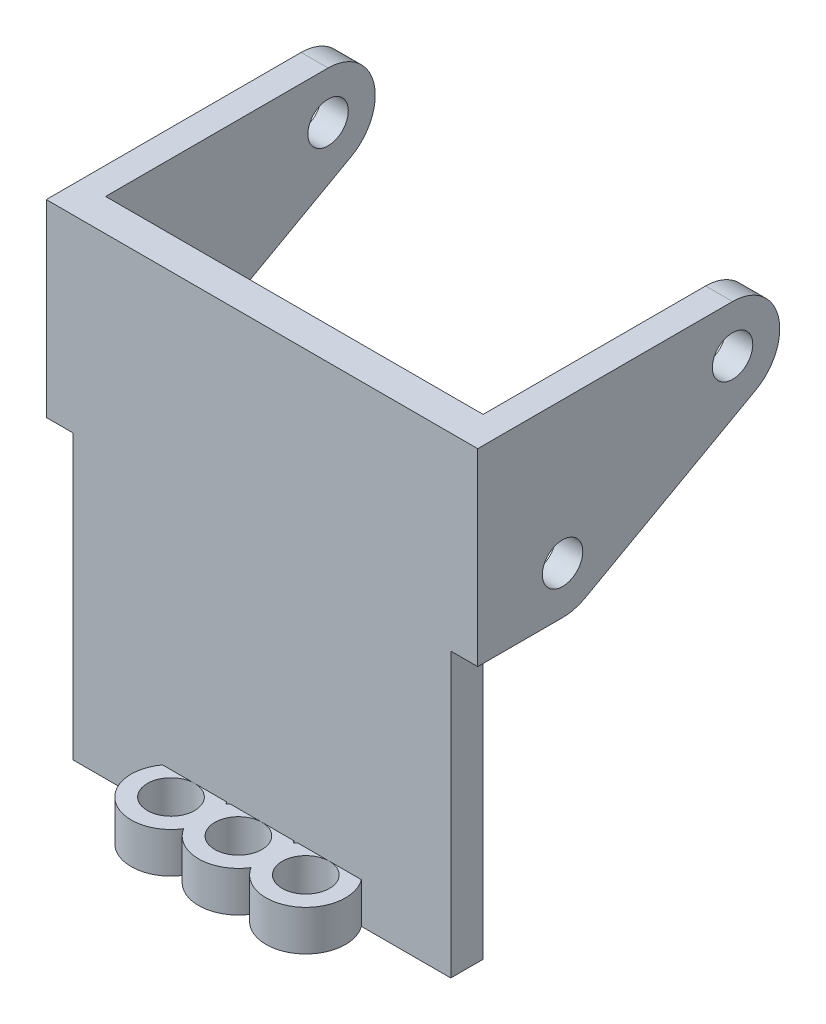
ISO-10303-21;
HEADER;
FILE_DESCRIPTION(('STEP AP214'),'2;1');
FILE_NAME('part.step','',(''),(''),'','','');
FILE_SCHEMA(('AUTOMOTIVE_DESIGN { 1 0 10303 214 1 1 1 1 }'));
ENDSEC;
DATA;
#1=APPLICATION_CONTEXT('core data for automotive mechanical design processes');
#2=APPLICATION_PROTOCOL_DEFINITION('international standard','automotive_design',2000,#1);
#3=PRODUCT_CONTEXT('',#1,'mechanical');
#4=PRODUCT('Part','Part','',(#3));
#5=PRODUCT_RELATED_PRODUCT_CATEGORY('part','',(#4));
#6=PRODUCT_DEFINITION_FORMATION('','',#4);
#7=PRODUCT_DEFINITION_CONTEXT('part definition',#1,'design');
#8=PRODUCT_DEFINITION('design','',#6,#7);
#9=PRODUCT_DEFINITION_SHAPE('','',#8);
#10=(LENGTH_UNIT() NAMED_UNIT(*) SI_UNIT(.MILLI.,.METRE.));
#11=(NAMED_UNIT(*) PLANE_ANGLE_UNIT() SI_UNIT($,.RADIAN.));
#12=(NAMED_UNIT(*) SI_UNIT($,.STERADIAN.) SOLID_ANGLE_UNIT());
#13=UNCERTAINTY_MEASURE_WITH_UNIT(LENGTH_MEASURE(1.E-05),#10,'distance_accuracy_value','');
#14=(GEOMETRIC_REPRESENTATION_CONTEXT(3) GLOBAL_UNCERTAINTY_ASSIGNED_CONTEXT((#13)) GLOBAL_UNIT_ASSIGNED_CONTEXT((#10,
#11,#12)) REPRESENTATION_CONTEXT('',''));
#15=CARTESIAN_POINT('',(0.,0.,0.));
#16=DIRECTION('',(0.,0.,1.));
#17=DIRECTION('',(1.,0.,0.));
#18=AXIS2_PLACEMENT_3D('',#15,#16,#17);
#19=CARTESIAN_POINT('',(-5.,3.,0.));
#20=DIRECTION('',(0.,-1.,0.));
#21=DIRECTION('',(0.,0.,-1.));
#22=AXIS2_PLACEMENT_3D('',#19,#20,#21);
#23=CYLINDRICAL_SURFACE('',#22,2.95);
#24=CARTESIAN_POINT('',(-5.,3.,0.));
#25=DIRECTION('',(0.,1.,0.));
#26=DIRECTION('',(1.,0.,0.));
#27=AXIS2_PLACEMENT_3D('',#24,#25,#26);
#28=CIRCLE('',#27,2.95);
#29=CARTESIAN_POINT('',(-7.37486841740758,3.,-1.75));
#30=VERTEX_POINT('',#29);
#31=CARTESIAN_POINT('',(-2.5,3.,1.56604597633658));
#32=VERTEX_POINT('',#31);
#33=EDGE_CURVE('E390',#30,#32,#28,.T.);
#34=ORIENTED_EDGE('',*,*,#33,.F.);
#35=DIRECTION('',(0.,-1.,0.));
#36=VECTOR('',#35,1.);
#37=CARTESIAN_POINT('',(-7.37486841740758,3.,-1.75));
#38=LINE('',#37,#36);
#39=CARTESIAN_POINT('',(-7.37486841740758,0.,-1.75));
#40=VERTEX_POINT('',#39);
#41=EDGE_CURVE('E374',#30,#40,#38,.T.);
#42=ORIENTED_EDGE('',*,*,#41,.T.);
#43=CARTESIAN_POINT('',(-5.,0.,0.));
#44=DIRECTION('',(0.,1.,0.));
#45=DIRECTION('',(1.,0.,0.));
#46=AXIS2_PLACEMENT_3D('',#43,#44,#45);
#47=CIRCLE('',#46,2.95);
#48=CARTESIAN_POINT('',(-2.5,0.,1.56604597633658));
#49=VERTEX_POINT('',#48);
#50=EDGE_CURVE('E381',#40,#49,#47,.T.);
#51=ORIENTED_EDGE('',*,*,#50,.T.);
#52=DIRECTION('',(0.,-1.,0.));
#53=VECTOR('',#52,1.);
#54=CARTESIAN_POINT('',(-2.5,1.5,1.56604597633658));
#55=LINE('',#54,#53);
#56=EDGE_CURVE('E396',#32,#49,#55,.T.);
#57=ORIENTED_EDGE('',*,*,#56,.F.);
#58=EDGE_LOOP('',(#34,#42,#51,#57));
#59=FACE_BOUND('',#58,.T.);
#60=ADVANCED_FACE('F69',(#59),#23,.T.);
#61=CARTESIAN_POINT('',(5.,3.,0.));
#62=DIRECTION('',(0.,-1.,0.));
#63=DIRECTION('',(0.,0.,-1.));
#64=AXIS2_PLACEMENT_3D('',#61,#62,#63);
#65=CYLINDRICAL_SURFACE('',#64,2.95);
#66=CARTESIAN_POINT('',(5.,3.,0.));
#67=DIRECTION('',(0.,1.,0.));
#68=DIRECTION('',(1.,0.,0.));
#69=AXIS2_PLACEMENT_3D('',#66,#67,#68);
#70=CIRCLE('',#69,2.95);
#71=CARTESIAN_POINT('',(2.62513158259242,3.,-1.75));
#72=VERTEX_POINT('',#71);
#73=CARTESIAN_POINT('',(2.5,3.,-1.56604597633658));
#74=VERTEX_POINT('',#73);
#75=EDGE_CURVE('E430',#72,#74,#70,.T.);
#76=ORIENTED_EDGE('',*,*,#75,.F.);
#77=DIRECTION('',(0.,-1.,0.));
#78=VECTOR('',#77,1.);
#79=CARTESIAN_POINT('',(2.62513158259242,3.,-1.75));
#80=LINE('',#79,#78);
#81=CARTESIAN_POINT('',(2.62513158259241,0.,-1.75));
#82=VERTEX_POINT('',#81);
#83=EDGE_CURVE('E366',#72,#82,#80,.T.);
#84=ORIENTED_EDGE('',*,*,#83,.T.);
#85=CARTESIAN_POINT('',(5.,0.,0.));
#86=DIRECTION('',(0.,1.,0.));
#87=DIRECTION('',(1.,0.,0.));
#88=AXIS2_PLACEMENT_3D('',#85,#86,#87);
#89=CIRCLE('',#88,2.95);
#90=CARTESIAN_POINT('',(2.5,0.,-1.56604597633658));
#91=VERTEX_POINT('',#90);
#92=EDGE_CURVE('E425',#82,#91,#89,.T.);
#93=ORIENTED_EDGE('',*,*,#92,.T.);
#94=DIRECTION('',(0.,-1.,0.));
#95=VECTOR('',#94,1.);
#96=CARTESIAN_POINT('',(2.5,1.5,-1.56604597633658));
#97=LINE('',#96,#95);
#98=EDGE_CURVE('E411',#91,#74,#97,.F.);
#99=ORIENTED_EDGE('',*,*,#98,.T.);
#100=EDGE_LOOP('',(#76,#84,#93,#99));
#101=FACE_BOUND('',#100,.T.);
#102=ADVANCED_FACE('F488',(#101),#65,.T.);
#103=CARTESIAN_POINT('',(0.,3.,0.));
#104=DIRECTION('',(0.,-1.,0.));
#105=DIRECTION('',(0.,0.,-1.));
#106=AXIS2_PLACEMENT_3D('',#103,#104,#105);
#107=CYLINDRICAL_SURFACE('',#106,2.95);
#108=CARTESIAN_POINT('',(0.,3.,0.));
#109=DIRECTION('',(0.,1.,0.));
#110=DIRECTION('',(1.,0.,0.));
#111=AXIS2_PLACEMENT_3D('',#108,#109,#110);
#112=CIRCLE('',#111,2.95);
#113=CARTESIAN_POINT('',(-2.37486841740758,3.,-1.75));
#114=VERTEX_POINT('',#113);
#115=CARTESIAN_POINT('',(-2.5,3.,-1.56604597633658));
#116=VERTEX_POINT('',#115);
#117=EDGE_CURVE('E412',#114,#116,#112,.T.);
#118=ORIENTED_EDGE('',*,*,#117,.F.);
#119=DIRECTION('',(0.,-1.,0.));
#120=VECTOR('',#119,1.);
#121=CARTESIAN_POINT('',(-2.37486841740758,3.,-1.75));
#122=LINE('',#121,#120);
#123=CARTESIAN_POINT('',(-2.37486841740758,0.,-1.75));
#124=VERTEX_POINT('',#123);
#125=EDGE_CURVE('E73',#114,#124,#122,.T.);
#126=ORIENTED_EDGE('',*,*,#125,.T.);
#127=CARTESIAN_POINT('',(0.,0.,0.));
#128=DIRECTION('',(0.,1.,0.));
#129=DIRECTION('',(1.,0.,0.));
#130=AXIS2_PLACEMENT_3D('',#127,#128,#129);
#131=CIRCLE('',#130,2.95);
#132=CARTESIAN_POINT('',(-2.5,0.,-1.56604597633658));
#133=VERTEX_POINT('',#132);
#134=EDGE_CURVE('E417',#124,#133,#131,.T.);
#135=ORIENTED_EDGE('',*,*,#134,.T.);
#136=DIRECTION('',(0.,-1.,0.));
#137=VECTOR('',#136,1.);
#138=CARTESIAN_POINT('',(-2.5,1.5,-1.56604597633658));
#139=LINE('',#138,#137);
#140=EDGE_CURVE('E389',#133,#116,#139,.F.);
#141=ORIENTED_EDGE('',*,*,#140,.T.);
#142=EDGE_LOOP('',(#118,#126,#135,#141));
#143=FACE_BOUND('',#142,.T.);
#144=ADVANCED_FACE('F440',(#143),#107,.T.);
#145=CARTESIAN_POINT('',(-5.,3.,0.));
#146=DIRECTION('',(0.,-1.,0.));
#147=DIRECTION('',(0.,0.,-1.));
#148=AXIS2_PLACEMENT_3D('',#145,#146,#147);
#149=CYLINDRICAL_SURFACE('',#148,1.75);
#150=CARTESIAN_POINT('',(-5.,0.,0.));
#151=DIRECTION('',(0.,1.,0.));
#152=DIRECTION('',(0.,0.,1.));
#153=AXIS2_PLACEMENT_3D('',#150,#151,#152);
#154=CIRCLE('',#153,1.75);
#155=CARTESIAN_POINT('',(-5.,0.,1.75));
#156=VERTEX_POINT('',#155);
#157=EDGE_CURVE('E382',#156,#156,#154,.T.);
#158=ORIENTED_EDGE('',*,*,#157,.F.);
#159=EDGE_LOOP('',(#158));
#160=FACE_BOUND('',#159,.T.);
#161=CARTESIAN_POINT('',(-5.,3.,0.));
#162=DIRECTION('',(0.,1.,0.));
#163=DIRECTION('',(0.,0.,1.));
#164=AXIS2_PLACEMENT_3D('',#161,#162,#163);
#165=CIRCLE('',#164,1.75);
#166=CARTESIAN_POINT('',(-5.,3.,-1.75));
#167=VERTEX_POINT('',#166);
#168=EDGE_CURVE('E378',#167,#167,#165,.T.);
#169=ORIENTED_EDGE('',*,*,#168,.T.);
#170=EDGE_LOOP('',(#169));
#171=FACE_BOUND('',#170,.T.);
#172=ADVANCED_FACE('F516',(#160,#171),#149,.F.);
#173=CARTESIAN_POINT('',(-5.,0.,0.));
#174=DIRECTION('',(0.,1.,0.));
#175=DIRECTION('',(0.,0.,1.));
#176=AXIS2_PLACEMENT_3D('',#173,#174,#175);
#177=PLANE('',#176);
#178=ORIENTED_EDGE('',*,*,#157,.T.);
#179=EDGE_LOOP('',(#178));
#180=FACE_BOUND('',#179,.T.);
#181=DIRECTION('',(-1.,0.,0.));
#182=VECTOR('',#181,1.);
#183=CARTESIAN_POINT('',(49.0821892133316,0.,-1.75));
#184=LINE('',#183,#182);
#185=CARTESIAN_POINT('',(-2.62513158259242,0.,-1.75));
#186=VERTEX_POINT('',#185);
#187=EDGE_CURVE('E448',#124,#186,#184,.T.);
#188=ORIENTED_EDGE('',*,*,#187,.T.);
#189=EDGE_CURVE('E391',#133,#186,#47,.T.);
#190=ORIENTED_EDGE('',*,*,#189,.F.);
#191=ORIENTED_EDGE('',*,*,#134,.F.);
#192=EDGE_LOOP('',(#188,#190,#191));
#193=FACE_BOUND('',#192,.T.);
#194=CARTESIAN_POINT('',(0.,0.,0.));
#195=DIRECTION('',(0.,1.,0.));
#196=DIRECTION('',(0.,0.,1.));
#197=AXIS2_PLACEMENT_3D('',#194,#195,#196);
#198=CIRCLE('',#197,1.75);
#199=CARTESIAN_POINT('',(0.,0.,1.75));
#200=VERTEX_POINT('',#199);
#201=EDGE_CURVE('E404',#200,#200,#198,.T.);
#202=ORIENTED_EDGE('',*,*,#201,.T.);
#203=EDGE_LOOP('',(#202));
#204=FACE_BOUND('',#203,.T.);
#205=CARTESIAN_POINT('',(2.37486841740758,0.,-1.75));
#206=VERTEX_POINT('',#205);
#207=EDGE_CURVE('E356',#82,#206,#184,.T.);
#208=ORIENTED_EDGE('',*,*,#207,.T.);
#209=EDGE_CURVE('E414',#91,#206,#131,.T.);
#210=ORIENTED_EDGE('',*,*,#209,.F.);
#211=ORIENTED_EDGE('',*,*,#92,.F.);
#212=EDGE_LOOP('',(#208,#210,#211));
#213=FACE_BOUND('',#212,.T.);
#214=CARTESIAN_POINT('',(5.,0.,0.));
#215=DIRECTION('',(0.,1.,0.));
#216=DIRECTION('',(0.,0.,1.));
#217=AXIS2_PLACEMENT_3D('',#214,#215,#216);
#218=CIRCLE('',#217,1.75);
#219=CARTESIAN_POINT('',(5.,0.,1.75));
#220=VERTEX_POINT('',#219);
#221=EDGE_CURVE('E377',#220,#220,#218,.T.);
#222=ORIENTED_EDGE('',*,*,#221,.T.);
#223=EDGE_LOOP('',(#222));
#224=FACE_BOUND('',#223,.T.);
#225=ORIENTED_EDGE('',*,*,#50,.F.);
#226=CARTESIAN_POINT('',(-14.,0.,-1.75));
#227=VERTEX_POINT('',#226);
#228=EDGE_CURVE('E343',#40,#227,#184,.T.);
#229=ORIENTED_EDGE('',*,*,#228,.T.);
#230=DIRECTION('',(0.,0.,1.));
#231=VECTOR('',#230,1.);
#232=CARTESIAN_POINT('',(-14.,0.,-4.14999999999999));
#233=LINE('',#232,#231);
#234=CARTESIAN_POINT('',(-14.,0.,-4.15));
#235=VERTEX_POINT('',#234);
#236=EDGE_CURVE('E335',#235,#227,#233,.T.);
#237=ORIENTED_EDGE('',*,*,#236,.F.);
#238=DIRECTION('',(-1.,0.,0.));
#239=VECTOR('',#238,1.);
#240=CARTESIAN_POINT('',(49.0821892133316,0.,-4.15));
#241=LINE('',#240,#239);
#242=CARTESIAN_POINT('',(14.,0.,-4.15));
#243=VERTEX_POINT('',#242);
#244=EDGE_CURVE('E352',#243,#235,#241,.T.);
#245=ORIENTED_EDGE('',*,*,#244,.F.);
#246=DIRECTION('',(0.,0.,1.));
#247=VECTOR('',#246,1.);
#248=CARTESIAN_POINT('',(14.,0.,-4.15000000000001));
#249=LINE('',#248,#247);
#250=CARTESIAN_POINT('',(14.,0.,-1.75));
#251=VERTEX_POINT('',#250);
#252=EDGE_CURVE('E340',#243,#251,#249,.T.);
#253=ORIENTED_EDGE('',*,*,#252,.T.);
#254=CARTESIAN_POINT('',(7.37486841740759,0.,-1.75));
#255=VERTEX_POINT('',#254);
#256=EDGE_CURVE('E348',#251,#255,#184,.T.);
#257=ORIENTED_EDGE('',*,*,#256,.T.);
#258=CARTESIAN_POINT('',(2.5,0.,1.56604597633658));
#259=VERTEX_POINT('',#258);
#260=EDGE_CURVE('E431',#259,#255,#89,.T.);
#261=ORIENTED_EDGE('',*,*,#260,.F.);
#262=EDGE_CURVE('E403',#49,#259,#131,.T.);
#263=ORIENTED_EDGE('',*,*,#262,.F.);
#264=EDGE_LOOP('',(#225,#229,#237,#245,#253,#257,#261,#263));
#265=FACE_BOUND('',#264,.T.);
#266=ADVANCED_FACE('F446',(#180,#193,#204,#213,#224,#265),#177,.F.);
#267=CARTESIAN_POINT('',(-5.,3.,0.));
#268=DIRECTION('',(0.,1.,0.));
#269=DIRECTION('',(0.,0.,1.));
#270=AXIS2_PLACEMENT_3D('',#267,#268,#269);
#271=PLANE('',#270);
#272=DIRECTION('',(1.,0.,0.));
#273=VECTOR('',#272,1.);
#274=CARTESIAN_POINT('',(-5.,3.,-1.75));
#275=LINE('',#274,#273);
#276=EDGE_CURVE('E361',#30,#167,#275,.T.);
#277=ORIENTED_EDGE('',*,*,#276,.F.);
#278=ORIENTED_EDGE('',*,*,#33,.T.);
#279=CARTESIAN_POINT('',(2.5,3.,1.56604597633658));
#280=VERTEX_POINT('',#279);
#281=EDGE_CURVE('E413',#32,#280,#112,.T.);
#282=ORIENTED_EDGE('',*,*,#281,.T.);
#283=CARTESIAN_POINT('',(7.37486841740758,3.,-1.75));
#284=VERTEX_POINT('',#283);
#285=EDGE_CURVE('E407',#280,#284,#70,.T.);
#286=ORIENTED_EDGE('',*,*,#285,.T.);
#287=CARTESIAN_POINT('',(5.,3.,-1.75));
#288=VERTEX_POINT('',#287);
#289=EDGE_CURVE('E365',#288,#284,#275,.T.);
#290=ORIENTED_EDGE('',*,*,#289,.F.);
#291=CARTESIAN_POINT('',(5.,3.,0.));
#292=DIRECTION('',(0.,1.,0.));
#293=DIRECTION('',(0.,0.,1.));
#294=AXIS2_PLACEMENT_3D('',#291,#292,#293);
#295=CIRCLE('',#294,1.75);
#296=EDGE_CURVE('E422',#288,#288,#295,.T.);
#297=ORIENTED_EDGE('',*,*,#296,.F.);
#298=EDGE_CURVE('E370',#72,#288,#275,.T.);
#299=ORIENTED_EDGE('',*,*,#298,.F.);
#300=ORIENTED_EDGE('',*,*,#75,.T.);
#301=CARTESIAN_POINT('',(2.37486841740758,3.,-1.75));
#302=VERTEX_POINT('',#301);
#303=EDGE_CURVE('E408',#74,#302,#112,.T.);
#304=ORIENTED_EDGE('',*,*,#303,.T.);
#305=CARTESIAN_POINT('',(0.,3.,-1.75));
#306=VERTEX_POINT('',#305);
#307=EDGE_CURVE('E358',#306,#302,#275,.T.);
#308=ORIENTED_EDGE('',*,*,#307,.F.);
#309=CARTESIAN_POINT('',(0.,3.,0.));
#310=DIRECTION('',(0.,1.,0.));
#311=DIRECTION('',(0.,0.,1.));
#312=AXIS2_PLACEMENT_3D('',#309,#310,#311);
#313=CIRCLE('',#312,1.75);
#314=EDGE_CURVE('E400',#306,#306,#313,.T.);
#315=ORIENTED_EDGE('',*,*,#314,.F.);
#316=EDGE_CURVE('E360',#114,#306,#275,.T.);
#317=ORIENTED_EDGE('',*,*,#316,.F.);
#318=ORIENTED_EDGE('',*,*,#117,.T.);
#319=CARTESIAN_POINT('',(-2.62513158259242,3.,-1.75));
#320=VERTEX_POINT('',#319);
#321=EDGE_CURVE('E386',#116,#320,#28,.T.);
#322=ORIENTED_EDGE('',*,*,#321,.T.);
#323=EDGE_CURVE('E373',#167,#320,#275,.T.);
#324=ORIENTED_EDGE('',*,*,#323,.F.);
#325=ORIENTED_EDGE('',*,*,#168,.F.);
#326=EDGE_LOOP('',(#277,#278,#282,#286,#290,#297,#299,#300,#304,#308,#315,#317,#318,#322,#324,#325));
#327=FACE_BOUND('',#326,.T.);
#328=ADVANCED_FACE('F466',(#327),#271,.T.);
#329=ORIENTED_EDGE('',*,*,#189,.T.);
#330=DIRECTION('',(0.,-1.,0.));
#331=VECTOR('',#330,1.);
#332=CARTESIAN_POINT('',(-2.62513158259242,3.,-1.75));
#333=LINE('',#332,#331);
#334=EDGE_CURVE('E369',#186,#320,#333,.F.);
#335=ORIENTED_EDGE('',*,*,#334,.T.);
#336=ORIENTED_EDGE('',*,*,#321,.F.);
#337=ORIENTED_EDGE('',*,*,#140,.F.);
#338=EDGE_LOOP('',(#329,#335,#336,#337));
#339=FACE_BOUND('',#338,.T.);
#340=ADVANCED_FACE('F473',(#339),#23,.T.);
#341=CARTESIAN_POINT('',(5.,3.,0.));
#342=DIRECTION('',(0.,-1.,0.));
#343=DIRECTION('',(0.,0.,-1.));
#344=AXIS2_PLACEMENT_3D('',#341,#342,#343);
#345=CYLINDRICAL_SURFACE('',#344,1.75);
#346=ORIENTED_EDGE('',*,*,#221,.F.);
#347=EDGE_LOOP('',(#346));
#348=FACE_BOUND('',#347,.T.);
#349=ORIENTED_EDGE('',*,*,#296,.T.);
#350=EDGE_LOOP('',(#349));
#351=FACE_BOUND('',#350,.T.);
#352=ADVANCED_FACE('F480',(#348,#351),#345,.F.);
#353=CARTESIAN_POINT('',(0.,3.,0.));
#354=DIRECTION('',(0.,-1.,0.));
#355=DIRECTION('',(0.,0.,-1.));
#356=AXIS2_PLACEMENT_3D('',#353,#354,#355);
#357=CYLINDRICAL_SURFACE('',#356,1.75);
#358=ORIENTED_EDGE('',*,*,#201,.F.);
#359=EDGE_LOOP('',(#358));
#360=FACE_BOUND('',#359,.T.);
#361=ORIENTED_EDGE('',*,*,#314,.T.);
#362=EDGE_LOOP('',(#361));
#363=FACE_BOUND('',#362,.T.);
#364=ADVANCED_FACE('F478',(#360,#363),#357,.F.);
#365=ORIENTED_EDGE('',*,*,#260,.T.);
#366=DIRECTION('',(0.,-1.,0.));
#367=VECTOR('',#366,1.);
#368=CARTESIAN_POINT('',(7.37486841740758,3.,-1.75));
#369=LINE('',#368,#367);
#370=EDGE_CURVE('E362',#255,#284,#369,.F.);
#371=ORIENTED_EDGE('',*,*,#370,.T.);
#372=ORIENTED_EDGE('',*,*,#285,.F.);
#373=DIRECTION('',(0.,-1.,0.));
#374=VECTOR('',#373,1.);
#375=CARTESIAN_POINT('',(2.5,1.5,1.56604597633658));
#376=LINE('',#375,#374);
#377=EDGE_CURVE('E385',#280,#259,#376,.T.);
#378=ORIENTED_EDGE('',*,*,#377,.T.);
#379=EDGE_LOOP('',(#365,#371,#372,#378));
#380=FACE_BOUND('',#379,.T.);
#381=ADVANCED_FACE('F71',(#380),#65,.T.);
#382=ORIENTED_EDGE('',*,*,#209,.T.);
#383=DIRECTION('',(0.,-1.,0.));
#384=VECTOR('',#383,1.);
#385=CARTESIAN_POINT('',(2.37486841740758,3.,-1.75));
#386=LINE('',#385,#384);
#387=EDGE_CURVE('E399',#206,#302,#386,.F.);
#388=ORIENTED_EDGE('',*,*,#387,.T.);
#389=ORIENTED_EDGE('',*,*,#303,.F.);
#390=ORIENTED_EDGE('',*,*,#98,.F.);
#391=EDGE_LOOP('',(#382,#388,#389,#390));
#392=FACE_BOUND('',#391,.T.);
#393=ADVANCED_FACE('F487',(#392),#107,.T.);
#394=ORIENTED_EDGE('',*,*,#281,.F.);
#395=ORIENTED_EDGE('',*,*,#56,.T.);
#396=ORIENTED_EDGE('',*,*,#262,.T.);
#397=ORIENTED_EDGE('',*,*,#377,.F.);
#398=EDGE_LOOP('',(#394,#395,#396,#397));
#399=FACE_BOUND('',#398,.T.);
#400=ADVANCED_FACE('F453',(#399),#107,.T.);
#401=CARTESIAN_POINT('',(49.0821892133316,0.,-1.75));
#402=DIRECTION('',(0.,0.,1.));
#403=DIRECTION('',(1.,0.,0.));
#404=AXIS2_PLACEMENT_3D('',#401,#402,#403);
#405=PLANE('',#404);
#406=ORIENTED_EDGE('',*,*,#41,.F.);
#407=ORIENTED_EDGE('',*,*,#276,.T.);
#408=ORIENTED_EDGE('',*,*,#323,.T.);
#409=ORIENTED_EDGE('',*,*,#334,.F.);
#410=ORIENTED_EDGE('',*,*,#187,.F.);
#411=ORIENTED_EDGE('',*,*,#125,.F.);
#412=ORIENTED_EDGE('',*,*,#316,.T.);
#413=ORIENTED_EDGE('',*,*,#307,.T.);
#414=ORIENTED_EDGE('',*,*,#387,.F.);
#415=ORIENTED_EDGE('',*,*,#207,.F.);
#416=ORIENTED_EDGE('',*,*,#83,.F.);
#417=ORIENTED_EDGE('',*,*,#298,.T.);
#418=ORIENTED_EDGE('',*,*,#289,.T.);
#419=ORIENTED_EDGE('',*,*,#370,.F.);
#420=ORIENTED_EDGE('',*,*,#256,.F.);
#421=DIRECTION('',(0.,1.,0.));
#422=VECTOR('',#421,1.);
#423=CARTESIAN_POINT('',(14.,0.,-1.75));
#424=LINE('',#423,#422);
#425=CARTESIAN_POINT('',(14.,21.,-1.75));
#426=VERTEX_POINT('',#425);
#427=EDGE_CURVE('E346',#251,#426,#424,.T.);
#428=ORIENTED_EDGE('',*,*,#427,.T.);
#429=DIRECTION('',(-1.,0.,0.));
#430=VECTOR('',#429,1.);
#431=CARTESIAN_POINT('',(16.,21.,-1.75));
#432=LINE('',#431,#430);
#433=CARTESIAN_POINT('',(16.,21.,-1.75));
#434=VERTEX_POINT('',#433);
#435=EDGE_CURVE('E325',#434,#426,#432,.T.);
#436=ORIENTED_EDGE('',*,*,#435,.F.);
#437=DIRECTION('',(0.,-1.,0.));
#438=VECTOR('',#437,1.);
#439=CARTESIAN_POINT('',(16.,35.,-1.75));
#440=LINE('',#439,#438);
#441=CARTESIAN_POINT('',(16.,35.,-1.75));
#442=VERTEX_POINT('',#441);
#443=EDGE_CURVE('E298',#442,#434,#440,.T.);
#444=ORIENTED_EDGE('',*,*,#443,.F.);
#445=DIRECTION('',(-1.,0.,0.));
#446=VECTOR('',#445,1.);
#447=CARTESIAN_POINT('',(49.0821892133316,35.,-1.75));
#448=LINE('',#447,#446);
#449=CARTESIAN_POINT('',(-16.,35.,-1.75000000000001));
#450=VERTEX_POINT('',#449);
#451=EDGE_CURVE('E253',#442,#450,#448,.T.);
#452=ORIENTED_EDGE('',*,*,#451,.T.);
#453=DIRECTION('',(0.,1.,0.));
#454=VECTOR('',#453,1.);
#455=CARTESIAN_POINT('',(-16.,35.,-1.75000000000001));
#456=LINE('',#455,#454);
#457=CARTESIAN_POINT('',(-16.,21.,-1.75000000000001));
#458=VERTEX_POINT('',#457);
#459=EDGE_CURVE('E246',#458,#450,#456,.T.);
#460=ORIENTED_EDGE('',*,*,#459,.F.);
#461=DIRECTION('',(1.,0.,0.));
#462=VECTOR('',#461,1.);
#463=CARTESIAN_POINT('',(-16.,21.,-1.75000000000001));
#464=LINE('',#463,#462);
#465=CARTESIAN_POINT('',(-14.,21.,-1.75000000000001));
#466=VERTEX_POINT('',#465);
#467=EDGE_CURVE('E251',#458,#466,#464,.T.);
#468=ORIENTED_EDGE('',*,*,#467,.T.);
#469=DIRECTION('',(0.,1.,0.));
#470=VECTOR('',#469,1.);
#471=CARTESIAN_POINT('',(-14.,0.,-1.75));
#472=LINE('',#471,#470);
#473=EDGE_CURVE('E332',#227,#466,#472,.T.);
#474=ORIENTED_EDGE('',*,*,#473,.F.);
#475=ORIENTED_EDGE('',*,*,#228,.F.);
#476=EDGE_LOOP('',(#406,#407,#408,#409,#410,#411,#412,#413,#414,#415,#416,#417,#418,#419,#420,
#428,#436,#444,#452,#460,#468,#474,#475));
#477=FACE_BOUND('',#476,.T.);
#478=ADVANCED_FACE('F248',(#477),#405,.T.);
#479=CARTESIAN_POINT('',(14.,35.,-24.15));
#480=DIRECTION('',(1.,0.,0.));
#481=DIRECTION('',(0.,0.,-1.));
#482=AXIS2_PLACEMENT_3D('',#479,#480,#481);
#483=PLANE('',#482);
#484=DIRECTION('',(0.,0.,-1.));
#485=VECTOR('',#484,1.);
#486=CARTESIAN_POINT('',(14.,21.,-1.75));
#487=LINE('',#486,#485);
#488=CARTESIAN_POINT('',(14.,21.,-4.15));
#489=VERTEX_POINT('',#488);
#490=EDGE_CURVE('E92',#426,#489,#487,.T.);
#491=ORIENTED_EDGE('',*,*,#490,.F.);
#492=ORIENTED_EDGE('',*,*,#427,.F.);
#493=ORIENTED_EDGE('',*,*,#252,.F.);
#494=DIRECTION('',(0.,1.,0.));
#495=VECTOR('',#494,1.);
#496=CARTESIAN_POINT('',(14.,0.,-4.15));
#497=LINE('',#496,#495);
#498=EDGE_CURVE('E344',#243,#489,#497,.T.);
#499=ORIENTED_EDGE('',*,*,#498,.T.);
#500=EDGE_LOOP('',(#491,#492,#493,#499));
#501=FACE_BOUND('',#500,.T.);
#502=ADVANCED_FACE('F507',(#501),#483,.T.);
#503=CARTESIAN_POINT('',(49.0821892133316,35.,-1.75));
#504=DIRECTION('',(0.,1.,0.));
#505=DIRECTION('',(0.,0.,1.));
#506=AXIS2_PLACEMENT_3D('',#503,#504,#505);
#507=PLANE('',#506);
#508=ORIENTED_EDGE('',*,*,#451,.F.);
#509=DIRECTION('',(0.,0.,1.));
#510=VECTOR('',#509,1.);
#511=CARTESIAN_POINT('',(16.,35.,-20.65));
#512=LINE('',#511,#510);
#513=CARTESIAN_POINT('',(16.,35.,-20.65));
#514=VERTEX_POINT('',#513);
#515=EDGE_CURVE('E294',#514,#442,#512,.T.);
#516=ORIENTED_EDGE('',*,*,#515,.F.);
#517=DIRECTION('',(-1.,0.,0.));
#518=VECTOR('',#517,1.);
#519=CARTESIAN_POINT('',(16.,35.,-20.65));
#520=LINE('',#519,#518);
#521=CARTESIAN_POINT('',(14.,35.,-20.65));
#522=VERTEX_POINT('',#521);
#523=EDGE_CURVE('E328',#514,#522,#520,.T.);
#524=ORIENTED_EDGE('',*,*,#523,.T.);
#525=DIRECTION('',(0.,0.,1.));
#526=VECTOR('',#525,1.);
#527=CARTESIAN_POINT('',(14.,35.,-20.65));
#528=LINE('',#527,#526);
#529=CARTESIAN_POINT('',(14.,35.,-4.15));
#530=VERTEX_POINT('',#529);
#531=EDGE_CURVE('E309',#522,#530,#528,.T.);
#532=ORIENTED_EDGE('',*,*,#531,.T.);
#533=DIRECTION('',(-1.,0.,0.));
#534=VECTOR('',#533,1.);
#535=CARTESIAN_POINT('',(49.0821892133316,35.,-4.15));
#536=LINE('',#535,#534);
#537=CARTESIAN_POINT('',(-14.,35.,-4.15));
#538=VERTEX_POINT('',#537);
#539=EDGE_CURVE('E349',#530,#538,#536,.T.);
#540=ORIENTED_EDGE('',*,*,#539,.T.);
#541=DIRECTION('',(0.,0.,-1.));
#542=VECTOR('',#541,1.);
#543=CARTESIAN_POINT('',(-14.,35.,-24.15));
#544=LINE('',#543,#542);
#545=CARTESIAN_POINT('',(-14.,35.,-20.65));
#546=VERTEX_POINT('',#545);
#547=EDGE_CURVE('E541',#538,#546,#544,.T.);
#548=ORIENTED_EDGE('',*,*,#547,.T.);
#549=DIRECTION('',(1.,0.,0.));
#550=VECTOR('',#549,1.);
#551=CARTESIAN_POINT('',(-16.,35.,-20.65));
#552=LINE('',#551,#550);
#553=CARTESIAN_POINT('',(-16.,35.,-20.65));
#554=VERTEX_POINT('',#553);
#555=EDGE_CURVE('E272',#554,#546,#552,.T.);
#556=ORIENTED_EDGE('',*,*,#555,.F.);
#557=DIRECTION('',(0.,0.,-1.));
#558=VECTOR('',#557,1.);
#559=CARTESIAN_POINT('',(-16.,35.,-24.15));
#560=LINE('',#559,#558);
#561=EDGE_CURVE('E256',#450,#554,#560,.T.);
#562=ORIENTED_EDGE('',*,*,#561,.F.);
#563=EDGE_LOOP('',(#508,#516,#524,#532,#540,#548,#556,#562));
#564=FACE_BOUND('',#563,.T.);
#565=ADVANCED_FACE('F513',(#564),#507,.T.);
#566=CARTESIAN_POINT('',(49.0821892133316,0.,-4.15));
#567=DIRECTION('',(0.,0.,1.));
#568=DIRECTION('',(1.,0.,0.));
#569=AXIS2_PLACEMENT_3D('',#566,#567,#568);
#570=PLANE('',#569);
#571=ORIENTED_EDGE('',*,*,#498,.F.);
#572=ORIENTED_EDGE('',*,*,#244,.T.);
#573=DIRECTION('',(0.,1.,0.));
#574=VECTOR('',#573,1.);
#575=CARTESIAN_POINT('',(-14.,0.,-4.15));
#576=LINE('',#575,#574);
#577=CARTESIAN_POINT('',(-14.,21.,-4.15));
#578=VERTEX_POINT('',#577);
#579=EDGE_CURVE('E338',#235,#578,#576,.T.);
#580=ORIENTED_EDGE('',*,*,#579,.T.);
#581=EDGE_CURVE('E331',#578,#538,#576,.T.);
#582=ORIENTED_EDGE('',*,*,#581,.T.);
#583=ORIENTED_EDGE('',*,*,#539,.F.);
#584=EDGE_CURVE('E334',#489,#530,#497,.T.);
#585=ORIENTED_EDGE('',*,*,#584,.F.);
#586=EDGE_LOOP('',(#571,#572,#580,#582,#583,#585));
#587=FACE_BOUND('',#586,.T.);
#588=ADVANCED_FACE('F533',(#587),#570,.F.);
#589=CARTESIAN_POINT('',(-14.,35.,-24.15));
#590=DIRECTION('',(-1.,0.,0.));
#591=DIRECTION('',(0.,0.,1.));
#592=AXIS2_PLACEMENT_3D('',#589,#590,#591);
#593=PLANE('',#592);
#594=DIRECTION('',(0.,0.,1.));
#595=VECTOR('',#594,1.);
#596=CARTESIAN_POINT('',(-14.,21.,-24.15));
#597=LINE('',#596,#595);
#598=EDGE_CURVE('E12',#578,#466,#597,.T.);
#599=ORIENTED_EDGE('',*,*,#598,.F.);
#600=ORIENTED_EDGE('',*,*,#579,.F.);
#601=ORIENTED_EDGE('',*,*,#236,.T.);
#602=ORIENTED_EDGE('',*,*,#473,.T.);
#603=EDGE_LOOP('',(#599,#600,#601,#602));
#604=FACE_BOUND('',#603,.T.);
#605=ADVANCED_FACE('F529',(#604),#593,.T.);
#606=CARTESIAN_POINT('',(14.,31.5,-20.65));
#607=DIRECTION('',(1.,0.,0.));
#608=DIRECTION('',(0.,1.,0.));
#609=AXIS2_PLACEMENT_3D('',#606,#607,#608);
#610=PLANE('',#609);
#611=CARTESIAN_POINT('',(14.,31.5,-20.65));
#612=DIRECTION('',(1.,0.,0.));
#613=DIRECTION('',(0.,1.,0.));
#614=AXIS2_PLACEMENT_3D('',#611,#612,#613);
#615=CIRCLE('',#614,1.5);
#616=CARTESIAN_POINT('',(14.,33.,-20.65));
#617=VERTEX_POINT('',#616);
#618=EDGE_CURVE('E283',#617,#617,#615,.T.);
#619=ORIENTED_EDGE('',*,*,#618,.T.);
#620=EDGE_LOOP('',(#619));
#621=FACE_BOUND('',#620,.T.);
#622=CARTESIAN_POINT('',(14.,24.5,-8.04152841971468));
#623=DIRECTION('',(1.,0.,0.));
#624=DIRECTION('',(0.,1.,0.));
#625=AXIS2_PLACEMENT_3D('',#622,#623,#624);
#626=CIRCLE('',#625,1.5);
#627=CARTESIAN_POINT('',(14.,26.,-8.04152841971468));
#628=VERTEX_POINT('',#627);
#629=EDGE_CURVE('E271',#628,#628,#626,.T.);
#630=ORIENTED_EDGE('',*,*,#629,.T.);
#631=EDGE_LOOP('',(#630));
#632=FACE_BOUND('',#631,.T.);
#633=CARTESIAN_POINT('',(14.,21.,-8.04152841971468));
#634=VERTEX_POINT('',#633);
#635=EDGE_CURVE('E312',#489,#634,#487,.T.);
#636=ORIENTED_EDGE('',*,*,#635,.F.);
#637=ORIENTED_EDGE('',*,*,#584,.T.);
#638=ORIENTED_EDGE('',*,*,#531,.F.);
#639=CARTESIAN_POINT('',(14.,31.5,-20.65));
#640=DIRECTION('',(1.,0.,0.));
#641=DIRECTION('',(0.,1.,0.));
#642=AXIS2_PLACEMENT_3D('',#639,#640,#641);
#643=CIRCLE('',#642,3.5);
#644=CARTESIAN_POINT('',(14.,28.4399647464929,-22.3488773491025));
#645=VERTEX_POINT('',#644);
#646=EDGE_CURVE('E288',#645,#522,#643,.T.);
#647=ORIENTED_EDGE('',*,*,#646,.F.);
#648=DIRECTION('',(0.,0.485393528315008,-0.874295786716319));
#649=VECTOR('',#648,1.);
#650=CARTESIAN_POINT('',(14.,21.4399647464929,-9.74040576881721));
#651=LINE('',#650,#649);
#652=CARTESIAN_POINT('',(14.,21.4399647464929,-9.74040576881721));
#653=VERTEX_POINT('',#652);
#654=EDGE_CURVE('E295',#653,#645,#651,.T.);
#655=ORIENTED_EDGE('',*,*,#654,.F.);
#656=CARTESIAN_POINT('',(14.,24.5,-8.04152841971468));
#657=DIRECTION('',(1.,0.,0.));
#658=DIRECTION('',(0.,1.,0.));
#659=AXIS2_PLACEMENT_3D('',#656,#657,#658);
#660=CIRCLE('',#659,3.5);
#661=EDGE_CURVE('E314',#634,#653,#660,.T.);
#662=ORIENTED_EDGE('',*,*,#661,.F.);
#663=EDGE_LOOP('',(#636,#637,#638,#647,#655,#662));
#664=FACE_BOUND('',#663,.T.);
#665=ADVANCED_FACE('F620',(#621,#632,#664),#610,.F.);
#666=CARTESIAN_POINT('',(16.,31.5,-20.65));
#667=DIRECTION('',(1.,0.,0.));
#668=DIRECTION('',(0.,1.,0.));
#669=AXIS2_PLACEMENT_3D('',#666,#667,#668);
#670=PLANE('',#669);
#671=CARTESIAN_POINT('',(16.,31.5,-20.65));
#672=DIRECTION('',(1.,0.,0.));
#673=DIRECTION('',(0.,1.,0.));
#674=AXIS2_PLACEMENT_3D('',#671,#672,#673);
#675=CIRCLE('',#674,1.5);
#676=CARTESIAN_POINT('',(16.,33.,-20.65));
#677=VERTEX_POINT('',#676);
#678=EDGE_CURVE('E285',#677,#677,#675,.T.);
#679=ORIENTED_EDGE('',*,*,#678,.F.);
#680=EDGE_LOOP('',(#679));
#681=FACE_BOUND('',#680,.T.);
#682=CARTESIAN_POINT('',(16.,31.5,-20.65));
#683=DIRECTION('',(1.,0.,0.));
#684=DIRECTION('',(0.,1.,0.));
#685=AXIS2_PLACEMENT_3D('',#682,#683,#684);
#686=CIRCLE('',#685,3.5);
#687=CARTESIAN_POINT('',(16.,28.4399647464929,-22.3488773491025));
#688=VERTEX_POINT('',#687);
#689=EDGE_CURVE('E291',#688,#514,#686,.T.);
#690=ORIENTED_EDGE('',*,*,#689,.T.);
#691=ORIENTED_EDGE('',*,*,#515,.T.);
#692=ORIENTED_EDGE('',*,*,#443,.T.);
#693=DIRECTION('',(0.,0.,-1.));
#694=VECTOR('',#693,1.);
#695=CARTESIAN_POINT('',(16.,21.,-1.75));
#696=LINE('',#695,#694);
#697=CARTESIAN_POINT('',(16.,21.,-8.04152841971468));
#698=VERTEX_POINT('',#697);
#699=EDGE_CURVE('E300',#434,#698,#696,.T.);
#700=ORIENTED_EDGE('',*,*,#699,.T.);
#701=CARTESIAN_POINT('',(16.,24.5,-8.04152841971468));
#702=DIRECTION('',(1.,0.,0.));
#703=DIRECTION('',(0.,1.,0.));
#704=AXIS2_PLACEMENT_3D('',#701,#702,#703);
#705=CIRCLE('',#704,3.5);
#706=CARTESIAN_POINT('',(16.,21.4399647464929,-9.74040576881721));
#707=VERTEX_POINT('',#706);
#708=EDGE_CURVE('E302',#698,#707,#705,.T.);
#709=ORIENTED_EDGE('',*,*,#708,.T.);
#710=DIRECTION('',(0.,0.485393528315008,-0.874295786716319));
#711=VECTOR('',#710,1.);
#712=CARTESIAN_POINT('',(16.,21.4399647464929,-9.74040576881721));
#713=LINE('',#712,#711);
#714=EDGE_CURVE('E304',#707,#688,#713,.T.);
#715=ORIENTED_EDGE('',*,*,#714,.T.);
#716=EDGE_LOOP('',(#690,#691,#692,#700,#709,#715));
#717=FACE_BOUND('',#716,.T.);
#718=CARTESIAN_POINT('',(16.,24.5,-8.04152841971468));
#719=DIRECTION('',(1.,0.,0.));
#720=DIRECTION('',(0.,1.,0.));
#721=AXIS2_PLACEMENT_3D('',#718,#719,#720);
#722=CIRCLE('',#721,1.5);
#723=CARTESIAN_POINT('',(16.,26.,-8.04152841971468));
#724=VERTEX_POINT('',#723);
#725=EDGE_CURVE('E275',#724,#724,#722,.T.);
#726=ORIENTED_EDGE('',*,*,#725,.F.);
#727=EDGE_LOOP('',(#726));
#728=FACE_BOUND('',#727,.T.);
#729=ADVANCED_FACE('F616',(#681,#717,#728),#670,.T.);
#730=CARTESIAN_POINT('',(16.,31.5,-20.65));
#731=DIRECTION('',(-1.,0.,0.));
#732=DIRECTION('',(0.,-1.,0.));
#733=AXIS2_PLACEMENT_3D('',#730,#731,#732);
#734=CYLINDRICAL_SURFACE('',#733,3.5);
#735=ORIENTED_EDGE('',*,*,#646,.T.);
#736=ORIENTED_EDGE('',*,*,#523,.F.);
#737=ORIENTED_EDGE('',*,*,#689,.F.);
#738=DIRECTION('',(-1.,0.,0.));
#739=VECTOR('',#738,1.);
#740=CARTESIAN_POINT('',(16.,28.4399647464929,-22.3488773491025));
#741=LINE('',#740,#739);
#742=EDGE_CURVE('E306',#688,#645,#741,.T.);
#743=ORIENTED_EDGE('',*,*,#742,.T.);
#744=EDGE_LOOP('',(#735,#736,#737,#743));
#745=FACE_BOUND('',#744,.T.);
#746=ADVANCED_FACE('F619',(#745),#734,.T.);
#747=CARTESIAN_POINT('',(16.,21.,-1.75));
#748=DIRECTION('',(0.,1.,0.));
#749=DIRECTION('',(0.,0.,1.));
#750=AXIS2_PLACEMENT_3D('',#747,#748,#749);
#751=PLANE('',#750);
#752=ORIENTED_EDGE('',*,*,#490,.T.);
#753=ORIENTED_EDGE('',*,*,#635,.T.);
#754=DIRECTION('',(-1.,0.,0.));
#755=VECTOR('',#754,1.);
#756=CARTESIAN_POINT('',(16.,21.,-8.04152841971468));
#757=LINE('',#756,#755);
#758=EDGE_CURVE('E322',#698,#634,#757,.T.);
#759=ORIENTED_EDGE('',*,*,#758,.F.);
#760=ORIENTED_EDGE('',*,*,#699,.F.);
#761=ORIENTED_EDGE('',*,*,#435,.T.);
#762=EDGE_LOOP('',(#752,#753,#759,#760,#761));
#763=FACE_BOUND('',#762,.T.);
#764=ADVANCED_FACE('F631',(#763),#751,.F.);
#765=CARTESIAN_POINT('',(16.,24.5,-8.04152841971468));
#766=DIRECTION('',(-1.,0.,0.));
#767=DIRECTION('',(0.,-1.,0.));
#768=AXIS2_PLACEMENT_3D('',#765,#766,#767);
#769=CYLINDRICAL_SURFACE('',#768,3.5);
#770=ORIENTED_EDGE('',*,*,#661,.T.);
#771=DIRECTION('',(-1.,0.,0.));
#772=VECTOR('',#771,1.);
#773=CARTESIAN_POINT('',(16.,21.4399647464929,-9.74040576881721));
#774=LINE('',#773,#772);
#775=EDGE_CURVE('E319',#707,#653,#774,.T.);
#776=ORIENTED_EDGE('',*,*,#775,.F.);
#777=ORIENTED_EDGE('',*,*,#708,.F.);
#778=ORIENTED_EDGE('',*,*,#758,.T.);
#779=EDGE_LOOP('',(#770,#776,#777,#778));
#780=FACE_BOUND('',#779,.T.);
#781=ADVANCED_FACE('F627',(#780),#769,.T.);
#782=CARTESIAN_POINT('',(16.,21.4399647464929,-9.74040576881721));
#783=DIRECTION('',(0.,0.874295786716319,0.485393528315009));
#784=DIRECTION('',(0.,-0.485393528315009,0.874295786716319));
#785=AXIS2_PLACEMENT_3D('',#782,#783,#784);
#786=PLANE('',#785);
#787=ORIENTED_EDGE('',*,*,#654,.T.);
#788=ORIENTED_EDGE('',*,*,#742,.F.);
#789=ORIENTED_EDGE('',*,*,#714,.F.);
#790=ORIENTED_EDGE('',*,*,#775,.T.);
#791=EDGE_LOOP('',(#787,#788,#789,#790));
#792=FACE_BOUND('',#791,.T.);
#793=ADVANCED_FACE('F614',(#792),#786,.F.);
#794=CARTESIAN_POINT('',(16.,31.5,-20.65));
#795=DIRECTION('',(-1.,0.,0.));
#796=DIRECTION('',(0.,-1.,0.));
#797=AXIS2_PLACEMENT_3D('',#794,#795,#796);
#798=CYLINDRICAL_SURFACE('',#797,1.5);
#799=ORIENTED_EDGE('',*,*,#678,.T.);
#800=EDGE_LOOP('',(#799));
#801=FACE_BOUND('',#800,.T.);
#802=ORIENTED_EDGE('',*,*,#618,.F.);
#803=EDGE_LOOP('',(#802));
#804=FACE_BOUND('',#803,.T.);
#805=ADVANCED_FACE('F595',(#801,#804),#798,.F.);
#806=CARTESIAN_POINT('',(16.,24.5,-8.04152841971468));
#807=DIRECTION('',(-1.,0.,0.));
#808=DIRECTION('',(0.,-1.,0.));
#809=AXIS2_PLACEMENT_3D('',#806,#807,#808);
#810=CYLINDRICAL_SURFACE('',#809,1.5);
#811=ORIENTED_EDGE('',*,*,#725,.T.);
#812=EDGE_LOOP('',(#811));
#813=FACE_BOUND('',#812,.T.);
#814=ORIENTED_EDGE('',*,*,#629,.F.);
#815=EDGE_LOOP('',(#814));
#816=FACE_BOUND('',#815,.T.);
#817=ADVANCED_FACE('F587',(#813,#816),#810,.F.);
#818=CARTESIAN_POINT('',(-16.,31.5,-20.65));
#819=DIRECTION('',(-1.,0.,0.));
#820=DIRECTION('',(0.,-1.,0.));
#821=AXIS2_PLACEMENT_3D('',#818,#819,#820);
#822=PLANE('',#821);
#823=CARTESIAN_POINT('',(-16.,31.5,-20.65));
#824=DIRECTION('',(-1.,0.,0.));
#825=DIRECTION('',(0.,-1.,0.));
#826=AXIS2_PLACEMENT_3D('',#823,#824,#825);
#827=CIRCLE('',#826,1.5);
#828=CARTESIAN_POINT('',(-16.,30.,-20.65));
#829=VERTEX_POINT('',#828);
#830=EDGE_CURVE('E543',#829,#829,#827,.T.);
#831=ORIENTED_EDGE('',*,*,#830,.F.);
#832=EDGE_LOOP('',(#831));
#833=FACE_BOUND('',#832,.T.);
#834=DIRECTION('',(0.,0.,1.));
#835=VECTOR('',#834,1.);
#836=CARTESIAN_POINT('',(-16.,21.,-24.15));
#837=LINE('',#836,#835);
#838=CARTESIAN_POINT('',(-16.,21.,-8.04152841971469));
#839=VERTEX_POINT('',#838);
#840=EDGE_CURVE('E257',#839,#458,#837,.T.);
#841=ORIENTED_EDGE('',*,*,#840,.T.);
#842=ORIENTED_EDGE('',*,*,#459,.T.);
#843=ORIENTED_EDGE('',*,*,#561,.T.);
#844=CARTESIAN_POINT('',(-16.,31.5,-20.65));
#845=DIRECTION('',(-1.,0.,0.));
#846=DIRECTION('',(0.,-1.,0.));
#847=AXIS2_PLACEMENT_3D('',#844,#845,#846);
#848=CIRCLE('',#847,3.5);
#849=CARTESIAN_POINT('',(-16.,28.4399647464929,-22.3488773491025));
#850=VERTEX_POINT('',#849);
#851=EDGE_CURVE('E571',#554,#850,#848,.T.);
#852=ORIENTED_EDGE('',*,*,#851,.T.);
#853=DIRECTION('',(0.,-0.485393528315008,0.874295786716319));
#854=VECTOR('',#853,1.);
#855=CARTESIAN_POINT('',(-16.,30.7499101256163,-26.5095745869153));
#856=LINE('',#855,#854);
#857=CARTESIAN_POINT('',(-16.,21.4399647464929,-9.74040576881722));
#858=VERTEX_POINT('',#857);
#859=EDGE_CURVE('E566',#850,#858,#856,.T.);
#860=ORIENTED_EDGE('',*,*,#859,.T.);
#861=CARTESIAN_POINT('',(-16.,24.5,-8.04152841971469));
#862=DIRECTION('',(-1.,0.,0.));
#863=DIRECTION('',(0.,-1.,0.));
#864=AXIS2_PLACEMENT_3D('',#861,#862,#863);
#865=CIRCLE('',#864,3.5);
#866=EDGE_CURVE('E263',#858,#839,#865,.T.);
#867=ORIENTED_EDGE('',*,*,#866,.T.);
#868=EDGE_LOOP('',(#841,#842,#843,#852,#860,#867));
#869=FACE_BOUND('',#868,.T.);
#870=CARTESIAN_POINT('',(-16.,24.5,-8.04152841971469));
#871=DIRECTION('',(-1.,0.,0.));
#872=DIRECTION('',(0.,-1.,0.));
#873=AXIS2_PLACEMENT_3D('',#870,#871,#872);
#874=CIRCLE('',#873,1.5);
#875=CARTESIAN_POINT('',(-16.,23.,-8.04152841971469));
#876=VERTEX_POINT('',#875);
#877=EDGE_CURVE('E576',#876,#876,#874,.T.);
#878=ORIENTED_EDGE('',*,*,#877,.F.);
#879=EDGE_LOOP('',(#878));
#880=FACE_BOUND('',#879,.T.);
#881=ADVANCED_FACE('F260',(#833,#869,#880),#822,.T.);
#882=CARTESIAN_POINT('',(-14.,31.5,-20.65));
#883=DIRECTION('',(-1.,0.,0.));
#884=DIRECTION('',(0.,-1.,0.));
#885=AXIS2_PLACEMENT_3D('',#882,#883,#884);
#886=PLANE('',#885);
#887=ORIENTED_EDGE('',*,*,#581,.F.);
#888=CARTESIAN_POINT('',(-14.,21.,-8.04152841971469));
#889=VERTEX_POINT('',#888);
#890=EDGE_CURVE('E79',#889,#578,#597,.T.);
#891=ORIENTED_EDGE('',*,*,#890,.F.);
#892=CARTESIAN_POINT('',(-14.,24.5,-8.04152841971469));
#893=DIRECTION('',(-1.,0.,0.));
#894=DIRECTION('',(0.,-1.,0.));
#895=AXIS2_PLACEMENT_3D('',#892,#893,#894);
#896=CIRCLE('',#895,3.5);
#897=CARTESIAN_POINT('',(-14.,21.4399647464929,-9.74040576881722));
#898=VERTEX_POINT('',#897);
#899=EDGE_CURVE('E267',#898,#889,#896,.T.);
#900=ORIENTED_EDGE('',*,*,#899,.F.);
#901=DIRECTION('',(0.,-0.485393528315008,0.874295786716319));
#902=VECTOR('',#901,1.);
#903=CARTESIAN_POINT('',(-14.,30.7499101256163,-26.5095745869153));
#904=LINE('',#903,#902);
#905=CARTESIAN_POINT('',(-14.,28.4399647464929,-22.3488773491025));
#906=VERTEX_POINT('',#905);
#907=EDGE_CURVE('E553',#906,#898,#904,.T.);
#908=ORIENTED_EDGE('',*,*,#907,.F.);
#909=CARTESIAN_POINT('',(-14.,31.5,-20.65));
#910=DIRECTION('',(-1.,0.,0.));
#911=DIRECTION('',(0.,-1.,0.));
#912=AXIS2_PLACEMENT_3D('',#909,#910,#911);
#913=CIRCLE('',#912,3.5);
#914=EDGE_CURVE('E544',#546,#906,#913,.T.);
#915=ORIENTED_EDGE('',*,*,#914,.F.);
#916=ORIENTED_EDGE('',*,*,#547,.F.);
#917=EDGE_LOOP('',(#887,#891,#900,#908,#915,#916));
#918=FACE_BOUND('',#917,.T.);
#919=CARTESIAN_POINT('',(-14.,31.5,-20.65));
#920=DIRECTION('',(-1.,0.,0.));
#921=DIRECTION('',(0.,-1.,0.));
#922=AXIS2_PLACEMENT_3D('',#919,#920,#921);
#923=CIRCLE('',#922,1.5);
#924=CARTESIAN_POINT('',(-14.,30.,-20.65));
#925=VERTEX_POINT('',#924);
#926=EDGE_CURVE('E547',#925,#925,#923,.T.);
#927=ORIENTED_EDGE('',*,*,#926,.T.);
#928=EDGE_LOOP('',(#927));
#929=FACE_BOUND('',#928,.T.);
#930=CARTESIAN_POINT('',(-14.,24.5,-8.04152841971469));
#931=DIRECTION('',(-1.,0.,0.));
#932=DIRECTION('',(0.,-1.,0.));
#933=AXIS2_PLACEMENT_3D('',#930,#931,#932);
#934=CIRCLE('',#933,1.5);
#935=CARTESIAN_POINT('',(-14.,23.,-8.04152841971469));
#936=VERTEX_POINT('',#935);
#937=EDGE_CURVE('E578',#936,#936,#934,.T.);
#938=ORIENTED_EDGE('',*,*,#937,.T.);
#939=EDGE_LOOP('',(#938));
#940=FACE_BOUND('',#939,.T.);
#941=ADVANCED_FACE('F537',(#918,#929,#940),#886,.F.);
#942=CARTESIAN_POINT('',(-16.,21.,-24.15));
#943=DIRECTION('',(0.,1.,0.));
#944=DIRECTION('',(0.,0.,1.));
#945=AXIS2_PLACEMENT_3D('',#942,#943,#944);
#946=PLANE('',#945);
#947=ORIENTED_EDGE('',*,*,#890,.T.);
#948=ORIENTED_EDGE('',*,*,#598,.T.);
#949=ORIENTED_EDGE('',*,*,#467,.F.);
#950=ORIENTED_EDGE('',*,*,#840,.F.);
#951=DIRECTION('',(1.,0.,0.));
#952=VECTOR('',#951,1.);
#953=CARTESIAN_POINT('',(-16.,21.,-8.04152841971469));
#954=LINE('',#953,#952);
#955=EDGE_CURVE('E542',#839,#889,#954,.T.);
#956=ORIENTED_EDGE('',*,*,#955,.T.);
#957=EDGE_LOOP('',(#947,#948,#949,#950,#956));
#958=FACE_BOUND('',#957,.T.);
#959=ADVANCED_FACE('F270',(#958),#946,.F.);
#960=CARTESIAN_POINT('',(-16.,31.5,-20.65));
#961=DIRECTION('',(1.,0.,0.));
#962=DIRECTION('',(0.,1.,0.));
#963=AXIS2_PLACEMENT_3D('',#960,#961,#962);
#964=CYLINDRICAL_SURFACE('',#963,3.5);
#965=ORIENTED_EDGE('',*,*,#914,.T.);
#966=DIRECTION('',(1.,0.,0.));
#967=VECTOR('',#966,1.);
#968=CARTESIAN_POINT('',(-16.,28.4399647464929,-22.3488773491025));
#969=LINE('',#968,#967);
#970=EDGE_CURVE('E278',#850,#906,#969,.T.);
#971=ORIENTED_EDGE('',*,*,#970,.F.);
#972=ORIENTED_EDGE('',*,*,#851,.F.);
#973=ORIENTED_EDGE('',*,*,#555,.T.);
#974=EDGE_LOOP('',(#965,#971,#972,#973));
#975=FACE_BOUND('',#974,.T.);
#976=ADVANCED_FACE('F607',(#975),#964,.T.);
#977=CARTESIAN_POINT('',(-16.,30.7499101256163,-26.5095745869153));
#978=DIRECTION('',(0.,0.874295786716319,0.485393528315008));
#979=DIRECTION('',(0.,-0.485393528315008,0.874295786716319));
#980=AXIS2_PLACEMENT_3D('',#977,#978,#979);
#981=PLANE('',#980);
#982=ORIENTED_EDGE('',*,*,#907,.T.);
#983=DIRECTION('',(1.,0.,0.));
#984=VECTOR('',#983,1.);
#985=CARTESIAN_POINT('',(-16.,21.4399647464929,-9.74040576881722));
#986=LINE('',#985,#984);
#987=EDGE_CURVE('E557',#858,#898,#986,.T.);
#988=ORIENTED_EDGE('',*,*,#987,.F.);
#989=ORIENTED_EDGE('',*,*,#859,.F.);
#990=ORIENTED_EDGE('',*,*,#970,.T.);
#991=EDGE_LOOP('',(#982,#988,#989,#990));
#992=FACE_BOUND('',#991,.T.);
#993=ADVANCED_FACE('F564',(#992),#981,.F.);
#994=CARTESIAN_POINT('',(-16.,24.5,-8.04152841971469));
#995=DIRECTION('',(1.,0.,0.));
#996=DIRECTION('',(0.,1.,0.));
#997=AXIS2_PLACEMENT_3D('',#994,#995,#996);
#998=CYLINDRICAL_SURFACE('',#997,3.5);
#999=ORIENTED_EDGE('',*,*,#899,.T.);
#1000=ORIENTED_EDGE('',*,*,#955,.F.);
#1001=ORIENTED_EDGE('',*,*,#866,.F.);
#1002=ORIENTED_EDGE('',*,*,#987,.T.);
#1003=EDGE_LOOP('',(#999,#1000,#1001,#1002));
#1004=FACE_BOUND('',#1003,.T.);
#1005=ADVANCED_FACE('F570',(#1004),#998,.T.);
#1006=CARTESIAN_POINT('',(-16.,31.5,-20.65));
#1007=DIRECTION('',(1.,0.,0.));
#1008=DIRECTION('',(0.,1.,0.));
#1009=AXIS2_PLACEMENT_3D('',#1006,#1007,#1008);
#1010=CYLINDRICAL_SURFACE('',#1009,1.5);
#1011=ORIENTED_EDGE('',*,*,#830,.T.);
#1012=EDGE_LOOP('',(#1011));
#1013=FACE_BOUND('',#1012,.T.);
#1014=ORIENTED_EDGE('',*,*,#926,.F.);
#1015=EDGE_LOOP('',(#1014));
#1016=FACE_BOUND('',#1015,.T.);
#1017=ADVANCED_FACE('F600',(#1013,#1016),#1010,.F.);
#1018=CARTESIAN_POINT('',(-16.,24.5,-8.04152841971469));
#1019=DIRECTION('',(1.,0.,0.));
#1020=DIRECTION('',(0.,1.,0.));
#1021=AXIS2_PLACEMENT_3D('',#1018,#1019,#1020);
#1022=CYLINDRICAL_SURFACE('',#1021,1.5);
#1023=ORIENTED_EDGE('',*,*,#877,.T.);
#1024=EDGE_LOOP('',(#1023));
#1025=FACE_BOUND('',#1024,.T.);
#1026=ORIENTED_EDGE('',*,*,#937,.F.);
#1027=EDGE_LOOP('',(#1026));
#1028=FACE_BOUND('',#1027,.T.);
#1029=ADVANCED_FACE('F584',(#1025,#1028),#1022,.F.);
#1030=CLOSED_SHELL('',(#60,#102,#144,#172,#266,#328,#340,#352,#364,#381,#393,#400,#478,#502,
#565,#588,#605,#665,#729,#746,#764,#781,#793,#805,#817,#881,#941,#959,#976,#993,#1005,#1017,#1029));
#1031=MANIFOLD_SOLID_BREP('B2',#1030);
#1032=ADVANCED_BREP_SHAPE_REPRESENTATION('',(#18,#1031),#14);
#1033=SHAPE_DEFINITION_REPRESENTATION(#9,#1032);
ENDSEC;
END-ISO-10303-21;
